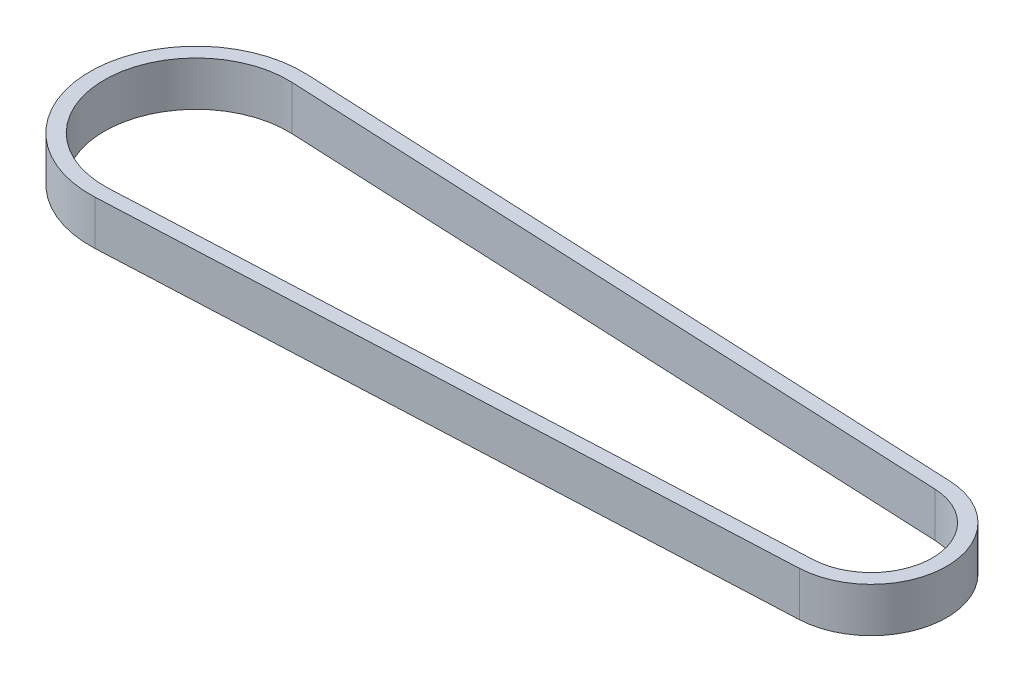
ISO-10303-21;
HEADER;
FILE_DESCRIPTION(('STEP AP214'),'2;1');
FILE_NAME('part.step','',(''),(''),'','','');
FILE_SCHEMA(('AUTOMOTIVE_DESIGN { 1 0 10303 214 1 1 1 1 }'));
ENDSEC;
DATA;
#1=APPLICATION_CONTEXT('core data for automotive mechanical design processes');
#2=APPLICATION_PROTOCOL_DEFINITION('international standard','automotive_design',2000,#1);
#3=PRODUCT_CONTEXT('',#1,'mechanical');
#4=PRODUCT('Part','Part','',(#3));
#5=PRODUCT_RELATED_PRODUCT_CATEGORY('part','',(#4));
#6=PRODUCT_DEFINITION_FORMATION('','',#4);
#7=PRODUCT_DEFINITION_CONTEXT('part definition',#1,'design');
#8=PRODUCT_DEFINITION('design','',#6,#7);
#9=PRODUCT_DEFINITION_SHAPE('','',#8);
#10=(LENGTH_UNIT() NAMED_UNIT(*) SI_UNIT(.MILLI.,.METRE.));
#11=(NAMED_UNIT(*) PLANE_ANGLE_UNIT() SI_UNIT($,.RADIAN.));
#12=(NAMED_UNIT(*) SI_UNIT($,.STERADIAN.) SOLID_ANGLE_UNIT());
#13=UNCERTAINTY_MEASURE_WITH_UNIT(LENGTH_MEASURE(1.E-05),#10,'distance_accuracy_value','');
#14=(GEOMETRIC_REPRESENTATION_CONTEXT(3) GLOBAL_UNCERTAINTY_ASSIGNED_CONTEXT((#13)) GLOBAL_UNIT_ASSIGNED_CONTEXT((#10,
#11,#12)) REPRESENTATION_CONTEXT('',''));
#15=CARTESIAN_POINT('',(0.,0.,0.));
#16=DIRECTION('',(0.,0.,1.));
#17=DIRECTION('',(1.,0.,0.));
#18=AXIS2_PLACEMENT_3D('',#15,#16,#17);
#19=CARTESIAN_POINT('',(-70.2013927416195,9.25,0.));
#20=DIRECTION('',(0.,1.,0.));
#21=DIRECTION('',(0.,0.,1.));
#22=AXIS2_PLACEMENT_3D('',#19,#20,#21);
#23=PLANE('',#22);
#24=CARTESIAN_POINT('',(-70.2013927416195,9.25,0.));
#25=DIRECTION('',(0.,1.,0.));
#26=DIRECTION('',(0.,0.,1.));
#27=AXIS2_PLACEMENT_3D('',#24,#25,#26);
#28=CIRCLE('',#27,22.1);
#29=CARTESIAN_POINT('',(-69.1940053203999,9.25,-22.0770281193726));
#30=VERTEX_POINT('',#29);
#31=CARTESIAN_POINT('',(-69.1940053203999,9.25,22.0770281193726));
#32=VERTEX_POINT('',#31);
#33=EDGE_CURVE('E155',#30,#32,#28,.T.);
#34=ORIENTED_EDGE('',*,*,#33,.T.);
#35=DIRECTION('',(0.998960548387901,0.,-0.0455831412316534));
#36=VECTOR('',#35,1.);
#37=CARTESIAN_POINT('',(-69.1940053203999,9.25,22.0770281193726));
#38=LINE('',#37,#36);
#39=CARTESIAN_POINT('',(70.9170480589564,9.25,15.68368060969));
#40=VERTEX_POINT('',#39);
#41=EDGE_CURVE('E159',#32,#40,#38,.T.);
#42=ORIENTED_EDGE('',*,*,#41,.T.);
#43=CARTESIAN_POINT('',(70.2013927416195,9.25,0.));
#44=DIRECTION('',(0.,1.,0.));
#45=DIRECTION('',(0.,0.,-1.));
#46=AXIS2_PLACEMENT_3D('',#43,#44,#45);
#47=CIRCLE('',#46,15.7);
#48=CARTESIAN_POINT('',(70.9170480589565,9.25,-15.68368060969));
#49=VERTEX_POINT('',#48);
#50=EDGE_CURVE('E163',#40,#49,#47,.T.);
#51=ORIENTED_EDGE('',*,*,#50,.T.);
#52=DIRECTION('',(-0.998960548387901,0.,-0.0455831412316532));
#53=VECTOR('',#52,1.);
#54=CARTESIAN_POINT('',(-69.1940053203999,9.25,-22.0770281193726));
#55=LINE('',#54,#53);
#56=EDGE_CURVE('E166',#49,#30,#55,.T.);
#57=ORIENTED_EDGE('',*,*,#56,.T.);
#58=EDGE_LOOP('',(#34,#42,#51,#57));
#59=FACE_BOUND('',#58,.T.);
#60=DIRECTION('',(0.998960548387901,0.,-0.0455831412316533));
#61=VECTOR('',#60,1.);
#62=CARTESIAN_POINT('',(-69.3307547440949,9.25,19.0801464742089));
#63=LINE('',#62,#61);
#64=CARTESIAN_POINT('',(-69.3307547440949,9.25,19.0801464742089));
#65=VERTEX_POINT('',#64);
#66=CARTESIAN_POINT('',(70.7802986352615,9.25,12.6867989645263));
#67=VERTEX_POINT('',#66);
#68=EDGE_CURVE('E116',#65,#67,#63,.T.);
#69=ORIENTED_EDGE('',*,*,#68,.F.);
#70=CARTESIAN_POINT('',(-70.2013927416195,9.25,0.));
#71=DIRECTION('',(0.,1.,0.));
#72=DIRECTION('',(0.,0.,1.));
#73=AXIS2_PLACEMENT_3D('',#70,#71,#72);
#74=CIRCLE('',#73,19.1);
#75=CARTESIAN_POINT('',(-69.3307547440949,9.25,-19.0801464742089));
#76=VERTEX_POINT('',#75);
#77=EDGE_CURVE('E107',#76,#65,#74,.T.);
#78=ORIENTED_EDGE('',*,*,#77,.F.);
#79=DIRECTION('',(-0.998960548387901,0.,-0.0455831412316533));
#80=VECTOR('',#79,1.);
#81=CARTESIAN_POINT('',(-69.3307547440949,9.25,-19.0801464742089));
#82=LINE('',#81,#80);
#83=CARTESIAN_POINT('',(70.7802986352614,9.25,-12.6867989645263));
#84=VERTEX_POINT('',#83);
#85=EDGE_CURVE('E133',#84,#76,#82,.T.);
#86=ORIENTED_EDGE('',*,*,#85,.F.);
#87=CARTESIAN_POINT('',(70.2013927416195,9.25,0.));
#88=DIRECTION('',(0.,1.,0.));
#89=DIRECTION('',(0.,0.,-1.));
#90=AXIS2_PLACEMENT_3D('',#87,#88,#89);
#91=CIRCLE('',#90,12.7);
#92=EDGE_CURVE('E129',#67,#84,#91,.T.);
#93=ORIENTED_EDGE('',*,*,#92,.F.);
#94=EDGE_LOOP('',(#69,#78,#86,#93));
#95=FACE_BOUND('',#94,.T.);
#96=ADVANCED_FACE('F41',(#59,#95),#23,.T.);
#97=CARTESIAN_POINT('',(-70.2013927416195,0.,0.));
#98=DIRECTION('',(0.,1.,0.));
#99=DIRECTION('',(0.,0.,1.));
#100=AXIS2_PLACEMENT_3D('',#97,#98,#99);
#101=PLANE('',#100);
#102=CARTESIAN_POINT('',(-70.2013927416195,0.,0.));
#103=DIRECTION('',(0.,1.,0.));
#104=DIRECTION('',(0.,0.,1.));
#105=AXIS2_PLACEMENT_3D('',#102,#103,#104);
#106=CIRCLE('',#105,22.1);
#107=CARTESIAN_POINT('',(-69.1940053203999,0.,-22.0770281193726));
#108=VERTEX_POINT('',#107);
#109=CARTESIAN_POINT('',(-69.1940053203999,0.,22.0770281193726));
#110=VERTEX_POINT('',#109);
#111=EDGE_CURVE('E125',#108,#110,#106,.T.);
#112=ORIENTED_EDGE('',*,*,#111,.F.);
#113=DIRECTION('',(-0.998960548387901,0.,-0.0455831412316532));
#114=VECTOR('',#113,1.);
#115=CARTESIAN_POINT('',(-69.1940053203999,0.,-22.0770281193726));
#116=LINE('',#115,#114);
#117=CARTESIAN_POINT('',(70.9170480589565,0.,-15.68368060969));
#118=VERTEX_POINT('',#117);
#119=EDGE_CURVE('E160',#118,#108,#116,.T.);
#120=ORIENTED_EDGE('',*,*,#119,.F.);
#121=CARTESIAN_POINT('',(70.2013927416195,0.,0.));
#122=DIRECTION('',(0.,1.,0.));
#123=DIRECTION('',(0.,0.,-1.));
#124=AXIS2_PLACEMENT_3D('',#121,#122,#123);
#125=CIRCLE('',#124,15.7);
#126=CARTESIAN_POINT('',(70.9170480589564,0.,15.68368060969));
#127=VERTEX_POINT('',#126);
#128=EDGE_CURVE('E176',#127,#118,#125,.T.);
#129=ORIENTED_EDGE('',*,*,#128,.F.);
#130=DIRECTION('',(0.998960548387901,0.,-0.0455831412316534));
#131=VECTOR('',#130,1.);
#132=CARTESIAN_POINT('',(-69.1940053203999,0.,22.0770281193726));
#133=LINE('',#132,#131);
#134=EDGE_CURVE('E173',#110,#127,#133,.T.);
#135=ORIENTED_EDGE('',*,*,#134,.F.);
#136=EDGE_LOOP('',(#112,#120,#129,#135));
#137=FACE_BOUND('',#136,.T.);
#138=CARTESIAN_POINT('',(-70.2013927416195,0.,0.));
#139=DIRECTION('',(0.,1.,0.));
#140=DIRECTION('',(0.,0.,1.));
#141=AXIS2_PLACEMENT_3D('',#138,#139,#140);
#142=CIRCLE('',#141,19.1);
#143=CARTESIAN_POINT('',(-69.3307547440949,0.,-19.0801464742089));
#144=VERTEX_POINT('',#143);
#145=CARTESIAN_POINT('',(-69.3307547440949,0.,19.0801464742089));
#146=VERTEX_POINT('',#145);
#147=EDGE_CURVE('E65',#144,#146,#142,.T.);
#148=ORIENTED_EDGE('',*,*,#147,.T.);
#149=DIRECTION('',(0.998960548387901,0.,-0.0455831412316533));
#150=VECTOR('',#149,1.);
#151=CARTESIAN_POINT('',(-69.3307547440949,0.,19.0801464742089));
#152=LINE('',#151,#150);
#153=CARTESIAN_POINT('',(70.7802986352615,0.,12.6867989645263));
#154=VERTEX_POINT('',#153);
#155=EDGE_CURVE('E123',#146,#154,#152,.T.);
#156=ORIENTED_EDGE('',*,*,#155,.T.);
#157=CARTESIAN_POINT('',(70.2013927416195,0.,0.));
#158=DIRECTION('',(0.,1.,0.));
#159=DIRECTION('',(0.,0.,-1.));
#160=AXIS2_PLACEMENT_3D('',#157,#158,#159);
#161=CIRCLE('',#160,12.7);
#162=CARTESIAN_POINT('',(70.7802986352615,0.,-12.6867989645263));
#163=VERTEX_POINT('',#162);
#164=EDGE_CURVE('E142',#154,#163,#161,.T.);
#165=ORIENTED_EDGE('',*,*,#164,.T.);
#166=DIRECTION('',(-0.998960548387901,0.,-0.0455831412316533));
#167=VECTOR('',#166,1.);
#168=CARTESIAN_POINT('',(-69.3307547440949,0.,-19.0801464742089));
#169=LINE('',#168,#167);
#170=EDGE_CURVE('E117',#163,#144,#169,.T.);
#171=ORIENTED_EDGE('',*,*,#170,.T.);
#172=EDGE_LOOP('',(#148,#156,#165,#171));
#173=FACE_BOUND('',#172,.T.);
#174=ADVANCED_FACE('F199',(#137,#173),#101,.F.);
#175=CARTESIAN_POINT('',(-70.2013927416195,9.25,0.));
#176=DIRECTION('',(0.,-1.,0.));
#177=DIRECTION('',(0.,0.,-1.));
#178=AXIS2_PLACEMENT_3D('',#175,#176,#177);
#179=CYLINDRICAL_SURFACE('',#178,22.1);
#180=ORIENTED_EDGE('',*,*,#111,.T.);
#181=DIRECTION('',(0.,-1.,0.));
#182=VECTOR('',#181,1.);
#183=CARTESIAN_POINT('',(-69.1940053203999,9.25,22.0770281193726));
#184=LINE('',#183,#182);
#185=EDGE_CURVE('E11',#32,#110,#184,.T.);
#186=ORIENTED_EDGE('',*,*,#185,.F.);
#187=ORIENTED_EDGE('',*,*,#33,.F.);
#188=DIRECTION('',(0.,-1.,0.));
#189=VECTOR('',#188,1.);
#190=CARTESIAN_POINT('',(-69.1940053203999,9.25,-22.0770281193726));
#191=LINE('',#190,#189);
#192=EDGE_CURVE('E169',#30,#108,#191,.T.);
#193=ORIENTED_EDGE('',*,*,#192,.T.);
#194=EDGE_LOOP('',(#180,#186,#187,#193));
#195=FACE_BOUND('',#194,.T.);
#196=ADVANCED_FACE('F43',(#195),#179,.T.);
#197=CARTESIAN_POINT('',(-69.1940053203999,9.25,22.0770281193726));
#198=DIRECTION('',(-0.0455831412316534,0.,-0.998960548387901));
#199=DIRECTION('',(-0.998960548387901,0.,0.0455831412316534));
#200=AXIS2_PLACEMENT_3D('',#197,#198,#199);
#201=PLANE('',#200);
#202=ORIENTED_EDGE('',*,*,#134,.T.);
#203=DIRECTION('',(0.,-1.,0.));
#204=VECTOR('',#203,1.);
#205=CARTESIAN_POINT('',(70.9170480589564,9.25,15.68368060969));
#206=LINE('',#205,#204);
#207=EDGE_CURVE('E50',#40,#127,#206,.T.);
#208=ORIENTED_EDGE('',*,*,#207,.F.);
#209=ORIENTED_EDGE('',*,*,#41,.F.);
#210=ORIENTED_EDGE('',*,*,#185,.T.);
#211=EDGE_LOOP('',(#202,#208,#209,#210));
#212=FACE_BOUND('',#211,.T.);
#213=ADVANCED_FACE('F209',(#212),#201,.F.);
#214=CARTESIAN_POINT('',(70.2013927416195,9.25,0.));
#215=DIRECTION('',(0.,-1.,0.));
#216=DIRECTION('',(0.,0.,-1.));
#217=AXIS2_PLACEMENT_3D('',#214,#215,#216);
#218=CYLINDRICAL_SURFACE('',#217,15.7);
#219=ORIENTED_EDGE('',*,*,#128,.T.);
#220=DIRECTION('',(0.,-1.,0.));
#221=VECTOR('',#220,1.);
#222=CARTESIAN_POINT('',(70.9170480589565,9.25,-15.68368060969));
#223=LINE('',#222,#221);
#224=EDGE_CURVE('E184',#49,#118,#223,.T.);
#225=ORIENTED_EDGE('',*,*,#224,.F.);
#226=ORIENTED_EDGE('',*,*,#50,.F.);
#227=ORIENTED_EDGE('',*,*,#207,.T.);
#228=EDGE_LOOP('',(#219,#225,#226,#227));
#229=FACE_BOUND('',#228,.T.);
#230=ADVANCED_FACE('F193',(#229),#218,.T.);
#231=CARTESIAN_POINT('',(-69.1940053203999,9.25,-22.0770281193726));
#232=DIRECTION('',(-0.0455831412316532,0.,0.998960548387901));
#233=DIRECTION('',(0.998960548387901,0.,0.0455831412316533));
#234=AXIS2_PLACEMENT_3D('',#231,#232,#233);
#235=PLANE('',#234);
#236=ORIENTED_EDGE('',*,*,#119,.T.);
#237=ORIENTED_EDGE('',*,*,#192,.F.);
#238=ORIENTED_EDGE('',*,*,#56,.F.);
#239=ORIENTED_EDGE('',*,*,#224,.T.);
#240=EDGE_LOOP('',(#236,#237,#238,#239));
#241=FACE_BOUND('',#240,.T.);
#242=ADVANCED_FACE('F203',(#241),#235,.F.);
#243=CARTESIAN_POINT('',(-70.2013927416195,9.25,0.));
#244=DIRECTION('',(0.,-1.,0.));
#245=DIRECTION('',(0.,0.,-1.));
#246=AXIS2_PLACEMENT_3D('',#243,#244,#245);
#247=CYLINDRICAL_SURFACE('',#246,19.1);
#248=ORIENTED_EDGE('',*,*,#147,.F.);
#249=DIRECTION('',(0.,-1.,0.));
#250=VECTOR('',#249,1.);
#251=CARTESIAN_POINT('',(-69.3307547440949,9.25,-19.0801464742089));
#252=LINE('',#251,#250);
#253=EDGE_CURVE('E111',#76,#144,#252,.T.);
#254=ORIENTED_EDGE('',*,*,#253,.F.);
#255=ORIENTED_EDGE('',*,*,#77,.T.);
#256=DIRECTION('',(0.,-1.,0.));
#257=VECTOR('',#256,1.);
#258=CARTESIAN_POINT('',(-69.3307547440949,9.25,19.0801464742089));
#259=LINE('',#258,#257);
#260=EDGE_CURVE('E110',#65,#146,#259,.T.);
#261=ORIENTED_EDGE('',*,*,#260,.T.);
#262=EDGE_LOOP('',(#248,#254,#255,#261));
#263=FACE_BOUND('',#262,.T.);
#264=ADVANCED_FACE('F109',(#263),#247,.F.);
#265=CARTESIAN_POINT('',(-69.3307547440949,9.25,19.0801464742089));
#266=DIRECTION('',(-0.0455831412316533,0.,-0.998960548387901));
#267=DIRECTION('',(-0.998960548387901,0.,0.0455831412316533));
#268=AXIS2_PLACEMENT_3D('',#265,#266,#267);
#269=PLANE('',#268);
#270=ORIENTED_EDGE('',*,*,#155,.F.);
#271=ORIENTED_EDGE('',*,*,#260,.F.);
#272=ORIENTED_EDGE('',*,*,#68,.T.);
#273=DIRECTION('',(0.,-1.,0.));
#274=VECTOR('',#273,1.);
#275=CARTESIAN_POINT('',(70.7802986352615,9.25,12.6867989645263));
#276=LINE('',#275,#274);
#277=EDGE_CURVE('E126',#67,#154,#276,.T.);
#278=ORIENTED_EDGE('',*,*,#277,.T.);
#279=EDGE_LOOP('',(#270,#271,#272,#278));
#280=FACE_BOUND('',#279,.T.);
#281=ADVANCED_FACE('F120',(#280),#269,.T.);
#282=CARTESIAN_POINT('',(70.2013927416195,9.25,0.));
#283=DIRECTION('',(0.,-1.,0.));
#284=DIRECTION('',(0.,0.,-1.));
#285=AXIS2_PLACEMENT_3D('',#282,#283,#284);
#286=CYLINDRICAL_SURFACE('',#285,12.7);
#287=ORIENTED_EDGE('',*,*,#164,.F.);
#288=ORIENTED_EDGE('',*,*,#277,.F.);
#289=ORIENTED_EDGE('',*,*,#92,.T.);
#290=DIRECTION('',(0.,-1.,0.));
#291=VECTOR('',#290,1.);
#292=CARTESIAN_POINT('',(70.7802986352615,9.25,-12.6867989645263));
#293=LINE('',#292,#291);
#294=EDGE_CURVE('E57',#84,#163,#293,.T.);
#295=ORIENTED_EDGE('',*,*,#294,.T.);
#296=EDGE_LOOP('',(#287,#288,#289,#295));
#297=FACE_BOUND('',#296,.T.);
#298=ADVANCED_FACE('F232',(#297),#286,.F.);
#299=CARTESIAN_POINT('',(-69.3307547440949,9.25,-19.0801464742089));
#300=DIRECTION('',(-0.0455831412316533,0.,0.998960548387901));
#301=DIRECTION('',(0.998960548387901,0.,0.0455831412316533));
#302=AXIS2_PLACEMENT_3D('',#299,#300,#301);
#303=PLANE('',#302);
#304=ORIENTED_EDGE('',*,*,#170,.F.);
#305=ORIENTED_EDGE('',*,*,#294,.F.);
#306=ORIENTED_EDGE('',*,*,#85,.T.);
#307=ORIENTED_EDGE('',*,*,#253,.T.);
#308=EDGE_LOOP('',(#304,#305,#306,#307));
#309=FACE_BOUND('',#308,.T.);
#310=ADVANCED_FACE('F236',(#309),#303,.T.);
#311=CLOSED_SHELL('',(#96,#174,#196,#213,#230,#242,#264,#281,#298,#310));
#312=MANIFOLD_SOLID_BREP('B2',#311);
#313=ADVANCED_BREP_SHAPE_REPRESENTATION('',(#18,#312),#14);
#314=SHAPE_DEFINITION_REPRESENTATION(#9,#313);
ENDSEC;
END-ISO-10303-21;
